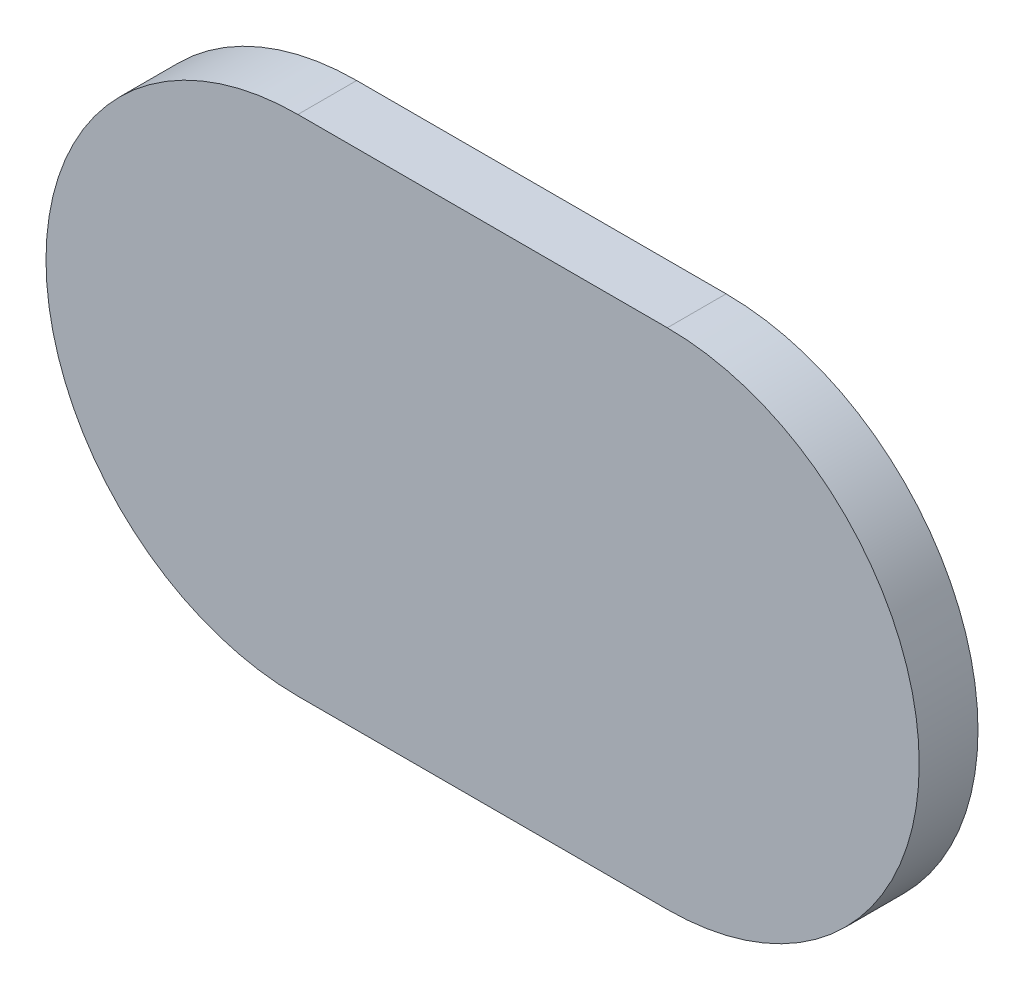
ISO-10303-21;
HEADER;
FILE_DESCRIPTION(('STEP AP214'),'2;1');
FILE_NAME('part.step','',(''),(''),'','','');
FILE_SCHEMA(('AUTOMOTIVE_DESIGN { 1 0 10303 214 1 1 1 1 }'));
ENDSEC;
DATA;
#1=APPLICATION_CONTEXT('core data for automotive mechanical design processes');
#2=APPLICATION_PROTOCOL_DEFINITION('international standard','automotive_design',2000,#1);
#3=PRODUCT_CONTEXT('',#1,'mechanical');
#4=PRODUCT('Part','Part','',(#3));
#5=PRODUCT_RELATED_PRODUCT_CATEGORY('part','',(#4));
#6=PRODUCT_DEFINITION_FORMATION('','',#4);
#7=PRODUCT_DEFINITION_CONTEXT('part definition',#1,'design');
#8=PRODUCT_DEFINITION('design','',#6,#7);
#9=PRODUCT_DEFINITION_SHAPE('','',#8);
#10=(LENGTH_UNIT() NAMED_UNIT(*) SI_UNIT(.MILLI.,.METRE.));
#11=(NAMED_UNIT(*) PLANE_ANGLE_UNIT() SI_UNIT($,.RADIAN.));
#12=(NAMED_UNIT(*) SI_UNIT($,.STERADIAN.) SOLID_ANGLE_UNIT());
#13=UNCERTAINTY_MEASURE_WITH_UNIT(LENGTH_MEASURE(1.E-05),#10,'distance_accuracy_value','');
#14=(GEOMETRIC_REPRESENTATION_CONTEXT(3) GLOBAL_UNCERTAINTY_ASSIGNED_CONTEXT((#13)) GLOBAL_UNIT_ASSIGNED_CONTEXT((#10,
#11,#12)) REPRESENTATION_CONTEXT('',''));
#15=CARTESIAN_POINT('',(0.,0.,0.));
#16=DIRECTION('',(0.,0.,1.));
#17=DIRECTION('',(1.,0.,0.));
#18=AXIS2_PLACEMENT_3D('',#15,#16,#17);
#19=CARTESIAN_POINT('',(127.9,-118.62,1.635));
#20=DIRECTION('',(0.,0.,1.));
#21=DIRECTION('',(1.,0.,0.));
#22=AXIS2_PLACEMENT_3D('',#19,#20,#21);
#23=PLANE('',#22);
#24=DIRECTION('',(-1.,0.,0.));
#25=VECTOR('',#24,1.);
#26=CARTESIAN_POINT('',(127.9,-118.62,1.635));
#27=LINE('',#26,#25);
#28=CARTESIAN_POINT('',(127.9,-118.62,1.635));
#29=VERTEX_POINT('',#28);
#30=CARTESIAN_POINT('',(127.68,-118.62,1.635));
#31=VERTEX_POINT('',#30);
#32=EDGE_CURVE('E86',#29,#31,#27,.T.);
#33=ORIENTED_EDGE('',*,*,#32,.T.);
#34=CARTESIAN_POINT('',(127.68,-118.77,1.635));
#35=DIRECTION('',(0.,0.,1.));
#36=DIRECTION('',(0.,1.,0.));
#37=AXIS2_PLACEMENT_3D('',#34,#35,#36);
#38=CIRCLE('',#37,0.15);
#39=CARTESIAN_POINT('',(127.68,-118.92,1.635));
#40=VERTEX_POINT('',#39);
#41=EDGE_CURVE('E72',#31,#40,#38,.T.);
#42=ORIENTED_EDGE('',*,*,#41,.T.);
#43=DIRECTION('',(1.,0.,0.));
#44=VECTOR('',#43,1.);
#45=CARTESIAN_POINT('',(127.68,-118.92,1.635));
#46=LINE('',#45,#44);
#47=CARTESIAN_POINT('',(127.9,-118.92,1.635));
#48=VERTEX_POINT('',#47);
#49=EDGE_CURVE('E111',#40,#48,#46,.T.);
#50=ORIENTED_EDGE('',*,*,#49,.T.);
#51=CARTESIAN_POINT('',(127.9,-118.77,1.635));
#52=DIRECTION('',(0.,0.,1.));
#53=DIRECTION('',(0.,-1.,0.));
#54=AXIS2_PLACEMENT_3D('',#51,#52,#53);
#55=CIRCLE('',#54,0.15);
#56=EDGE_CURVE('E11',#48,#29,#55,.T.);
#57=ORIENTED_EDGE('',*,*,#56,.T.);
#58=EDGE_LOOP('',(#33,#42,#50,#57));
#59=FACE_BOUND('',#58,.T.);
#60=ADVANCED_FACE('F17',(#59),#23,.T.);
#61=CARTESIAN_POINT('',(127.9,-118.62,1.6));
#62=DIRECTION('',(0.,0.,1.));
#63=DIRECTION('',(1.,0.,0.));
#64=AXIS2_PLACEMENT_3D('',#61,#62,#63);
#65=PLANE('',#64);
#66=CARTESIAN_POINT('',(127.9,-118.77,1.6));
#67=DIRECTION('',(0.,0.,1.));
#68=DIRECTION('',(0.,-1.,0.));
#69=AXIS2_PLACEMENT_3D('',#66,#67,#68);
#70=CIRCLE('',#69,0.15);
#71=CARTESIAN_POINT('',(127.9,-118.92,1.6));
#72=VERTEX_POINT('',#71);
#73=CARTESIAN_POINT('',(127.9,-118.62,1.6));
#74=VERTEX_POINT('',#73);
#75=EDGE_CURVE('E21',#72,#74,#70,.T.);
#76=ORIENTED_EDGE('',*,*,#75,.F.);
#77=DIRECTION('',(1.,0.,0.));
#78=VECTOR('',#77,1.);
#79=CARTESIAN_POINT('',(127.68,-118.92,1.6));
#80=LINE('',#79,#78);
#81=CARTESIAN_POINT('',(127.68,-118.92,1.6));
#82=VERTEX_POINT('',#81);
#83=EDGE_CURVE('E83',#82,#72,#80,.T.);
#84=ORIENTED_EDGE('',*,*,#83,.F.);
#85=CARTESIAN_POINT('',(127.68,-118.77,1.6));
#86=DIRECTION('',(0.,0.,1.));
#87=DIRECTION('',(0.,1.,0.));
#88=AXIS2_PLACEMENT_3D('',#85,#86,#87);
#89=CIRCLE('',#88,0.15);
#90=CARTESIAN_POINT('',(127.68,-118.62,1.6));
#91=VERTEX_POINT('',#90);
#92=EDGE_CURVE('E102',#91,#82,#89,.T.);
#93=ORIENTED_EDGE('',*,*,#92,.F.);
#94=DIRECTION('',(-1.,0.,0.));
#95=VECTOR('',#94,1.);
#96=CARTESIAN_POINT('',(127.9,-118.62,1.6));
#97=LINE('',#96,#95);
#98=EDGE_CURVE('E93',#74,#91,#97,.T.);
#99=ORIENTED_EDGE('',*,*,#98,.F.);
#100=EDGE_LOOP('',(#76,#84,#93,#99));
#101=FACE_BOUND('',#100,.T.);
#102=ADVANCED_FACE('F19',(#101),#65,.F.);
#103=CARTESIAN_POINT('',(127.9,-118.77,1.6));
#104=DIRECTION('',(0.,0.,-1.));
#105=DIRECTION('',(0.,-1.,0.));
#106=AXIS2_PLACEMENT_3D('',#103,#104,#105);
#107=CYLINDRICAL_SURFACE('',#106,0.15);
#108=ORIENTED_EDGE('',*,*,#75,.T.);
#109=DIRECTION('',(0.,0.,1.));
#110=VECTOR('',#109,1.);
#111=CARTESIAN_POINT('',(127.9,-118.62,1.6));
#112=LINE('',#111,#110);
#113=EDGE_CURVE('E90',#74,#29,#112,.T.);
#114=ORIENTED_EDGE('',*,*,#113,.T.);
#115=ORIENTED_EDGE('',*,*,#56,.F.);
#116=DIRECTION('',(0.,0.,1.));
#117=VECTOR('',#116,1.);
#118=CARTESIAN_POINT('',(127.9,-118.92,1.6));
#119=LINE('',#118,#117);
#120=EDGE_CURVE('E110',#72,#48,#119,.T.);
#121=ORIENTED_EDGE('',*,*,#120,.F.);
#122=EDGE_LOOP('',(#108,#114,#115,#121));
#123=FACE_BOUND('',#122,.T.);
#124=ADVANCED_FACE('F119',(#123),#107,.T.);
#125=CARTESIAN_POINT('',(127.68,-118.92,1.6));
#126=DIRECTION('',(0.,1.,0.));
#127=DIRECTION('',(1.,0.,0.));
#128=AXIS2_PLACEMENT_3D('',#125,#126,#127);
#129=PLANE('',#128);
#130=ORIENTED_EDGE('',*,*,#83,.T.);
#131=ORIENTED_EDGE('',*,*,#120,.T.);
#132=ORIENTED_EDGE('',*,*,#49,.F.);
#133=DIRECTION('',(0.,0.,1.));
#134=VECTOR('',#133,1.);
#135=CARTESIAN_POINT('',(127.68,-118.92,1.6));
#136=LINE('',#135,#134);
#137=EDGE_CURVE('E80',#82,#40,#136,.T.);
#138=ORIENTED_EDGE('',*,*,#137,.F.);
#139=EDGE_LOOP('',(#130,#131,#132,#138));
#140=FACE_BOUND('',#139,.T.);
#141=ADVANCED_FACE('F118',(#140),#129,.F.);
#142=CARTESIAN_POINT('',(127.68,-118.77,1.6));
#143=DIRECTION('',(0.,0.,-1.));
#144=DIRECTION('',(0.,1.,0.));
#145=AXIS2_PLACEMENT_3D('',#142,#143,#144);
#146=CYLINDRICAL_SURFACE('',#145,0.15);
#147=ORIENTED_EDGE('',*,*,#92,.T.);
#148=ORIENTED_EDGE('',*,*,#137,.T.);
#149=ORIENTED_EDGE('',*,*,#41,.F.);
#150=DIRECTION('',(0.,0.,1.));
#151=VECTOR('',#150,1.);
#152=CARTESIAN_POINT('',(127.68,-118.62,1.6));
#153=LINE('',#152,#151);
#154=EDGE_CURVE('E77',#91,#31,#153,.T.);
#155=ORIENTED_EDGE('',*,*,#154,.F.);
#156=EDGE_LOOP('',(#147,#148,#149,#155));
#157=FACE_BOUND('',#156,.T.);
#158=ADVANCED_FACE('F75',(#157),#146,.T.);
#159=CARTESIAN_POINT('',(127.9,-118.62,1.6));
#160=DIRECTION('',(0.,-1.,0.));
#161=DIRECTION('',(0.,0.,-1.));
#162=AXIS2_PLACEMENT_3D('',#159,#160,#161);
#163=PLANE('',#162);
#164=ORIENTED_EDGE('',*,*,#98,.T.);
#165=ORIENTED_EDGE('',*,*,#154,.T.);
#166=ORIENTED_EDGE('',*,*,#32,.F.);
#167=ORIENTED_EDGE('',*,*,#113,.F.);
#168=EDGE_LOOP('',(#164,#165,#166,#167));
#169=FACE_BOUND('',#168,.T.);
#170=ADVANCED_FACE('F92',(#169),#163,.F.);
#171=CLOSED_SHELL('',(#60,#102,#124,#141,#158,#170));
#172=MANIFOLD_SOLID_BREP('B1',#171);
#173=ADVANCED_BREP_SHAPE_REPRESENTATION('',(#18,#172),#14);
#174=SHAPE_DEFINITION_REPRESENTATION(#9,#173);
ENDSEC;
END-ISO-10303-21;
